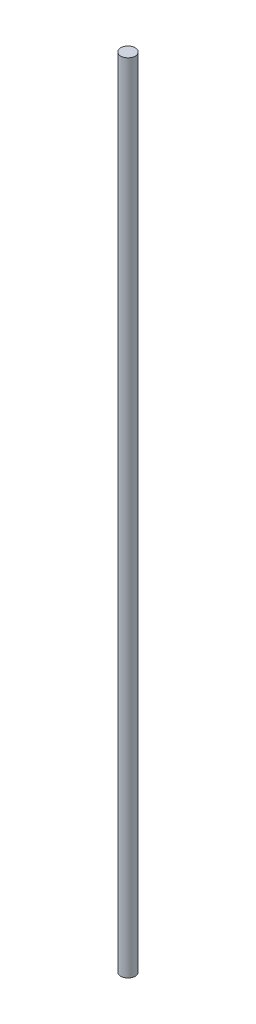
ISO-10303-21;
HEADER;
FILE_DESCRIPTION(('STEP AP214'),'2;1');
FILE_NAME('part.step','',(''),(''),'','','');
FILE_SCHEMA(('AUTOMOTIVE_DESIGN { 1 0 10303 214 1 1 1 1 }'));
ENDSEC;
DATA;
#1=APPLICATION_CONTEXT('core data for automotive mechanical design processes');
#2=APPLICATION_PROTOCOL_DEFINITION('international standard','automotive_design',2000,#1);
#3=PRODUCT_CONTEXT('',#1,'mechanical');
#4=PRODUCT('Part','Part','',(#3));
#5=PRODUCT_RELATED_PRODUCT_CATEGORY('part','',(#4));
#6=PRODUCT_DEFINITION_FORMATION('','',#4);
#7=PRODUCT_DEFINITION_CONTEXT('part definition',#1,'design');
#8=PRODUCT_DEFINITION('design','',#6,#7);
#9=PRODUCT_DEFINITION_SHAPE('','',#8);
#10=(LENGTH_UNIT() NAMED_UNIT(*) SI_UNIT(.MILLI.,.METRE.));
#11=(NAMED_UNIT(*) PLANE_ANGLE_UNIT() SI_UNIT($,.RADIAN.));
#12=(NAMED_UNIT(*) SI_UNIT($,.STERADIAN.) SOLID_ANGLE_UNIT());
#13=UNCERTAINTY_MEASURE_WITH_UNIT(LENGTH_MEASURE(1.E-05),#10,'distance_accuracy_value','');
#14=(GEOMETRIC_REPRESENTATION_CONTEXT(3) GLOBAL_UNCERTAINTY_ASSIGNED_CONTEXT((#13)) GLOBAL_UNIT_ASSIGNED_CONTEXT((#10,
#11,#12)) REPRESENTATION_CONTEXT('',''));
#15=CARTESIAN_POINT('',(0.,0.,0.));
#16=DIRECTION('',(0.,0.,1.));
#17=DIRECTION('',(1.,0.,0.));
#18=AXIS2_PLACEMENT_3D('',#15,#16,#17);
#19=CARTESIAN_POINT('',(0.,275.,0.));
#20=DIRECTION('',(0.,-1.,0.));
#21=DIRECTION('',(0.,0.,-1.));
#22=AXIS2_PLACEMENT_3D('',#19,#20,#21);
#23=CYLINDRICAL_SURFACE('',#22,2.5);
#24=CARTESIAN_POINT('',(0.,275.,0.));
#25=DIRECTION('',(0.,1.,0.));
#26=DIRECTION('',(0.,0.,1.));
#27=AXIS2_PLACEMENT_3D('',#24,#25,#26);
#28=CIRCLE('',#27,2.5);
#29=CARTESIAN_POINT('',(0.,275.,2.5));
#30=VERTEX_POINT('',#29);
#31=EDGE_CURVE('E10',#30,#30,#28,.T.);
#32=ORIENTED_EDGE('',*,*,#31,.F.);
#33=EDGE_LOOP('',(#32));
#34=FACE_BOUND('',#33,.T.);
#35=CARTESIAN_POINT('',(0.,0.,0.));
#36=DIRECTION('',(0.,1.,0.));
#37=DIRECTION('',(0.,0.,1.));
#38=AXIS2_PLACEMENT_3D('',#35,#36,#37);
#39=CIRCLE('',#38,2.5);
#40=CARTESIAN_POINT('',(0.,0.,2.5));
#41=VERTEX_POINT('',#40);
#42=EDGE_CURVE('E38',#41,#41,#39,.T.);
#43=ORIENTED_EDGE('',*,*,#42,.T.);
#44=EDGE_LOOP('',(#43));
#45=FACE_BOUND('',#44,.T.);
#46=ADVANCED_FACE('F35',(#34,#45),#23,.T.);
#47=CARTESIAN_POINT('',(0.,275.,0.));
#48=DIRECTION('',(0.,1.,0.));
#49=DIRECTION('',(0.,0.,1.));
#50=AXIS2_PLACEMENT_3D('',#47,#48,#49);
#51=PLANE('',#50);
#52=ORIENTED_EDGE('',*,*,#31,.T.);
#53=EDGE_LOOP('',(#52));
#54=FACE_BOUND('',#53,.T.);
#55=ADVANCED_FACE('F50',(#54),#51,.T.);
#56=CARTESIAN_POINT('',(0.,0.,0.));
#57=DIRECTION('',(0.,1.,0.));
#58=DIRECTION('',(0.,0.,1.));
#59=AXIS2_PLACEMENT_3D('',#56,#57,#58);
#60=PLANE('',#59);
#61=ORIENTED_EDGE('',*,*,#42,.F.);
#62=EDGE_LOOP('',(#61));
#63=FACE_BOUND('',#62,.T.);
#64=ADVANCED_FACE('F48',(#63),#60,.F.);
#65=CLOSED_SHELL('',(#46,#55,#64));
#66=MANIFOLD_SOLID_BREP('B2',#65);
#67=ADVANCED_BREP_SHAPE_REPRESENTATION('',(#18,#66),#14);
#68=SHAPE_DEFINITION_REPRESENTATION(#9,#67);
ENDSEC;
END-ISO-10303-21;
